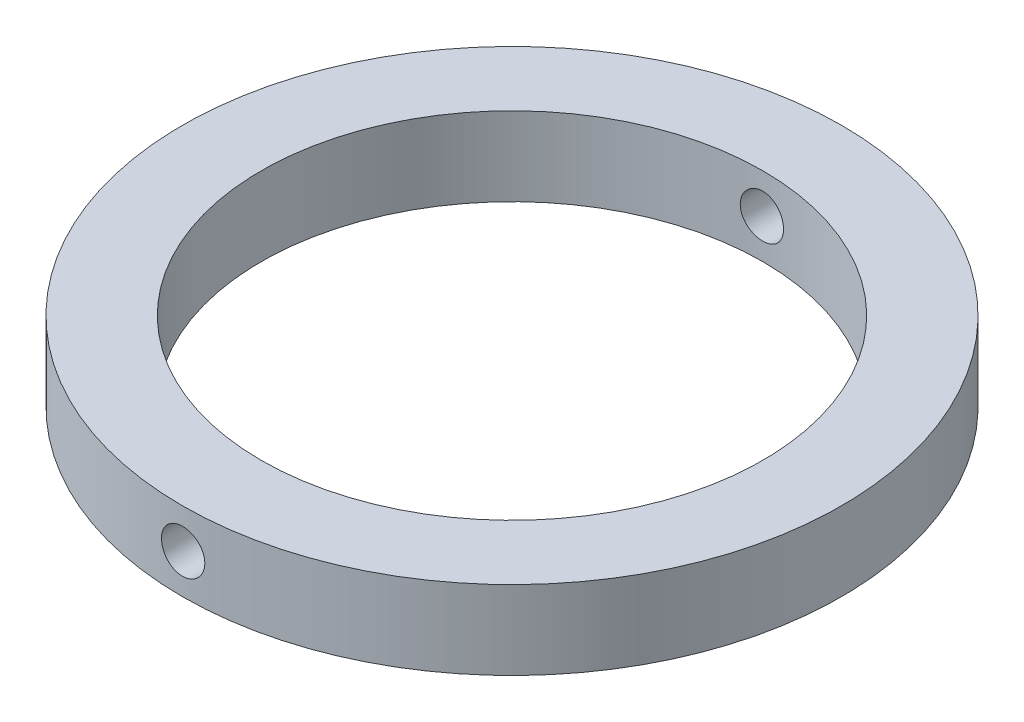
ISO-10303-21;
HEADER;
FILE_DESCRIPTION(('STEP AP214'),'2;1');
FILE_NAME('part.step','',(''),(''),'','','');
FILE_SCHEMA(('AUTOMOTIVE_DESIGN { 1 0 10303 214 1 1 1 1 }'));
ENDSEC;
DATA;
#1=APPLICATION_CONTEXT('core data for automotive mechanical design processes');
#2=APPLICATION_PROTOCOL_DEFINITION('international standard','automotive_design',2000,#1);
#3=PRODUCT_CONTEXT('',#1,'mechanical');
#4=PRODUCT('Part','Part','',(#3));
#5=PRODUCT_RELATED_PRODUCT_CATEGORY('part','',(#4));
#6=PRODUCT_DEFINITION_FORMATION('','',#4);
#7=PRODUCT_DEFINITION_CONTEXT('part definition',#1,'design');
#8=PRODUCT_DEFINITION('design','',#6,#7);
#9=PRODUCT_DEFINITION_SHAPE('','',#8);
#10=(LENGTH_UNIT() NAMED_UNIT(*) SI_UNIT(.MILLI.,.METRE.));
#11=(NAMED_UNIT(*) PLANE_ANGLE_UNIT() SI_UNIT($,.RADIAN.));
#12=(NAMED_UNIT(*) SI_UNIT($,.STERADIAN.) SOLID_ANGLE_UNIT());
#13=UNCERTAINTY_MEASURE_WITH_UNIT(LENGTH_MEASURE(1.E-05),#10,'distance_accuracy_value','');
#14=(GEOMETRIC_REPRESENTATION_CONTEXT(3) GLOBAL_UNCERTAINTY_ASSIGNED_CONTEXT((#13)) GLOBAL_UNIT_ASSIGNED_CONTEXT((#10,
#11,#12)) REPRESENTATION_CONTEXT('',''));
#15=CARTESIAN_POINT('',(0.,0.,0.));
#16=DIRECTION('',(0.,0.,1.));
#17=DIRECTION('',(1.,0.,0.));
#18=AXIS2_PLACEMENT_3D('',#15,#16,#17);
#19=CARTESIAN_POINT('',(0.,10.,0.));
#20=DIRECTION('',(0.,-1.,0.));
#21=DIRECTION('',(0.,0.,-1.));
#22=AXIS2_PLACEMENT_3D('',#19,#20,#21);
#23=CYLINDRICAL_SURFACE('',#22,41.85);
#24=CARTESIAN_POINT('',(0.,10.,0.));
#25=DIRECTION('',(0.,1.,0.));
#26=DIRECTION('',(0.,0.,1.));
#27=AXIS2_PLACEMENT_3D('',#24,#25,#26);
#28=CIRCLE('',#27,41.85);
#29=CARTESIAN_POINT('',(0.,10.,41.85));
#30=VERTEX_POINT('',#29);
#31=EDGE_CURVE('E10',#30,#30,#28,.T.);
#32=ORIENTED_EDGE('',*,*,#31,.F.);
#33=EDGE_LOOP('',(#32));
#34=FACE_BOUND('',#33,.T.);
#35=CARTESIAN_POINT('',(0.,0.,0.));
#36=DIRECTION('',(0.,1.,0.));
#37=DIRECTION('',(0.,0.,1.));
#38=AXIS2_PLACEMENT_3D('',#35,#36,#37);
#39=CIRCLE('',#38,41.85);
#40=CARTESIAN_POINT('',(0.,0.,41.85));
#41=VERTEX_POINT('',#40);
#42=EDGE_CURVE('E48',#41,#41,#39,.T.);
#43=ORIENTED_EDGE('',*,*,#42,.T.);
#44=EDGE_LOOP('',(#43));
#45=FACE_BOUND('',#44,.T.);
#46=CARTESIAN_POINT('',(0.,7.75,-41.85));
#47=CARTESIAN_POINT('',(0.154290099332612,7.74999321754741,-41.8499988011758));
#48=CARTESIAN_POINT('',(0.308687825769506,7.73697157858766,-41.8491376375957));
#49=CARTESIAN_POINT('',(0.613218841201266,7.68521323826535,-41.8457850773138));
#50=CARTESIAN_POINT('',(0.763346973857226,7.64644671476278,-41.8432917900545));
#51=CARTESIAN_POINT('',(1.05488365405529,7.54431791111544,-41.8369569989291));
#52=CARTESIAN_POINT('',(1.19629680024165,7.48096873354768,-41.8331162133853));
#53=CARTESIAN_POINT('',(1.46644583797839,7.33149442391011,-41.8245182357857));
#54=CARTESIAN_POINT('',(1.59518459769578,7.24537446111875,-41.8197612517859));
#55=CARTESIAN_POINT('',(1.83657817459748,7.05264884275964,-41.8098567335951));
#56=CARTESIAN_POINT('',(1.94920943303032,6.94601370536758,-41.804708643878));
#57=CARTESIAN_POINT('',(2.15498922700986,6.71534579064044,-41.7946068640215));
#58=CARTESIAN_POINT('',(2.24813694296539,6.59131228179512,-41.7896531820671));
#59=CARTESIAN_POINT('',(2.41237951241051,6.32923328148415,-41.7804945168638));
#60=CARTESIAN_POINT('',(2.48345457634963,6.19117536253465,-41.7762902069053));
#61=CARTESIAN_POINT('',(2.60140770033902,5.90505354364975,-41.7691116752754));
#62=CARTESIAN_POINT('',(2.64828604313305,5.75698976065784,-41.7661374392305));
#63=CARTESIAN_POINT('',(2.71644905753053,5.45528799244626,-41.7617598003493));
#64=CARTESIAN_POINT('',(2.73777093124992,5.30165844590535,-41.7603541144079));
#65=CARTESIAN_POINT('',(2.75433061301864,4.99299495634095,-41.7592652613331));
#66=CARTESIAN_POINT('',(2.74956874274023,4.8379610306602,-41.7595820729574));
#67=CARTESIAN_POINT('',(2.71412695981282,4.53114331553306,-41.7619003689473));
#68=CARTESIAN_POINT('',(2.683487327807,4.37935485056886,-41.7638992350534));
#69=CARTESIAN_POINT('',(2.59722226061068,4.08308011249805,-41.769352265633));
#70=CARTESIAN_POINT('',(2.54159666285057,3.9385938869098,-41.7728064395754));
#71=CARTESIAN_POINT('',(2.40689302759663,3.6608957926856,-41.7807838468435));
#72=CARTESIAN_POINT('',(2.32779674482857,3.5276927991685,-41.7853079113064));
#73=CARTESIAN_POINT('',(2.1484102038833,3.27643934494015,-41.7949144584274));
#74=CARTESIAN_POINT('',(2.04811968150902,3.15838907314484,-41.7999969480461));
#75=CARTESIAN_POINT('',(1.82896480218378,2.94055773694956,-41.8101592283428));
#76=CARTESIAN_POINT('',(1.71006558988451,2.8408117352164,-41.8152389956332));
#77=CARTESIAN_POINT('',(1.4571905540584,2.66269090365282,-41.8248141399912));
#78=CARTESIAN_POINT('',(1.32321472472832,2.58431608204856,-41.829309516834));
#79=CARTESIAN_POINT('',(1.04396806424317,2.45116524605297,-41.8372097464952));
#80=CARTESIAN_POINT('',(0.898696583449396,2.39639059014784,-41.8406145365338));
#81=CARTESIAN_POINT('',(0.600991973656429,2.31201851186089,-41.8459491056359));
#82=CARTESIAN_POINT('',(0.44855893711889,2.2824207645184,-41.8478789037373));
#83=CARTESIAN_POINT('',(0.141162405527342,2.24928619099311,-41.8500435844614));
#84=CARTESIAN_POINT('',(-0.0137958435674341,2.24570089380397,-41.8502816194599));
#85=CARTESIAN_POINT('',(-0.322111494498557,2.26456630211203,-41.8490443411495));
#86=CARTESIAN_POINT('',(-0.475468905551681,2.28701685762509,-41.8475690377105));
#87=CARTESIAN_POINT('',(-0.776092853861847,2.35727654288242,-41.8430731701016));
#88=CARTESIAN_POINT('',(-0.923364617797856,2.40506340308875,-41.8400539630403));
#89=CARTESIAN_POINT('',(-1.20779816693384,2.52461656904448,-41.8328098889319));
#90=CARTESIAN_POINT('',(-1.34495985170388,2.59638311296036,-41.8285850099103));
#91=CARTESIAN_POINT('',(-1.60550150430209,2.76198163226646,-41.8193963040407));
#92=CARTESIAN_POINT('',(-1.72886088017293,2.85584594490211,-41.8144313982026));
#93=CARTESIAN_POINT('',(-1.95808882318597,3.06292851796911,-41.8043248823149));
#94=CARTESIAN_POINT('',(-2.06395720041093,3.17614698852076,-41.7991832703473));
#95=CARTESIAN_POINT('',(-2.255362406773,3.41893330820694,-41.7892936761702));
#96=CARTESIAN_POINT('',(-2.34086776488973,3.54852599666441,-41.7845463105478));
#97=CARTESIAN_POINT('',(-2.4889044098989,3.82025741406678,-41.7759904323852));
#98=CARTESIAN_POINT('',(-2.5514358505387,3.96239605904303,-41.772181913562));
#99=CARTESIAN_POINT('',(-2.65169524528746,4.25507012213475,-41.7659376892427));
#100=CARTESIAN_POINT('',(-2.68944293341243,4.40559875586404,-41.7635008917372));
#101=CARTESIAN_POINT('',(-2.73912772853688,4.71087389977274,-41.7602718954646));
#102=CARTESIAN_POINT('',(-2.75106512394346,4.86562036280208,-41.7594796783207));
#103=CARTESIAN_POINT('',(-2.74878763293919,5.17462559078792,-41.7596296300074));
#104=CARTESIAN_POINT('',(-2.73462221841803,5.32888472439922,-41.7605685179271));
#105=CARTESIAN_POINT('',(-2.6806438619129,5.63282899559131,-41.7640679273305));
#106=CARTESIAN_POINT('',(-2.64083087428527,5.78251412503148,-41.7666284516999));
#107=CARTESIAN_POINT('',(-2.53669886815668,6.07306820030999,-41.7730817810187));
#108=CARTESIAN_POINT('',(-2.472380157137,6.21393725674066,-41.7769745692516));
#109=CARTESIAN_POINT('',(-2.32106902496006,6.48288400887214,-41.7856537102544));
#110=CARTESIAN_POINT('',(-2.23407715953305,6.61096201798146,-41.7904400411222));
#111=CARTESIAN_POINT('',(-2.03970545239938,6.85094240947175,-41.8003775294771));
#112=CARTESIAN_POINT('',(-1.93228965654435,6.96281564381602,-41.8055293201369));
#113=CARTESIAN_POINT('',(-1.70017112323984,7.16698201260253,-41.8156117188951));
#114=CARTESIAN_POINT('',(-1.57546416925335,7.25927035723655,-41.8205422726544));
#115=CARTESIAN_POINT('',(-1.31214821799897,7.42172256832539,-41.8296322322455));
#116=CARTESIAN_POINT('',(-1.17352108598708,7.49185706746362,-41.8337906114939));
#117=CARTESIAN_POINT('',(-0.886531552137562,7.60776872481375,-41.8408541940417));
#118=CARTESIAN_POINT('',(-0.73818075243376,7.65357433825889,-41.8437608605963));
#119=CARTESIAN_POINT('',(-0.490772188367824,7.70765506650704,-41.8472338972108));
#120=CARTESIAN_POINT('',(-0.393312628345785,7.7235138062974,-41.8482665606961));
#121=CARTESIAN_POINT('',(-0.197250043047792,7.74468843311883,-41.8496499948046));
#122=CARTESIAN_POINT('',(-0.098647019538159,7.75000433643335,-41.850000766481));
#123=CARTESIAN_POINT('',(0.,7.75,-41.85));
#124=B_SPLINE_CURVE_WITH_KNOTS('',3,(#46,#47,#48,#49,#50,#51,#52,#53,#54,#55,#56,#57,#58,#59,
#60,#61,#62,#63,#64,#65,#66,#67,#68,#69,#70,#71,#72,#73,#74,#75,#76,#77,#78,#79,#80,#81,#82,#83,
#84,#85,#86,#87,#88,#89,#90,#91,#92,#93,#94,#95,#96,#97,#98,#99,#100,#101,#102,#103,#104,#105,
#106,#107,#108,#109,#110,#111,#112,#113,#114,#115,#116,#117,#118,#119,#120,#121,#122,#123),
.UNSPECIFIED.,.T.,.F.,(4,2,2,2,2,2,2,2,2,2,2,2,2,2,2,2,2,2,2,2,2,2,2,2,2,2,2,2,2,2,2,2,2,2,2,2,
2,2,4),(0.,0.462510171268374,0.925557037819973,1.38835743821623,1.8510528666862,
2.31441825776961,2.77780313677942,3.24160227862634,3.70539600076009,4.1685137631446,
4.63162581423995,5.09401832303994,5.55641384041119,6.01916975346513,6.4819314353491,
6.94557051042958,7.40920976397302,7.87287570221902,8.33653565579533,8.79933141356662,
9.26212450533419,9.72451149430553,10.1869030758461,10.6499755608511,11.1130530735666,
11.5768416937236,12.0406272100314,12.5040429886966,12.9674535890752,13.4299868041329,
13.8925208423395,14.3550490771723,14.8175659762748,15.2809047543452,15.7443567193051,
16.2084204864863,16.6719402795252,16.9676515440041,17.2633623517557),.UNSPECIFIED.);
#125=CARTESIAN_POINT('',(0.,7.75,-41.85));
#126=VERTEX_POINT('',#125);
#127=EDGE_CURVE('E81',#126,#126,#124,.T.);
#128=ORIENTED_EDGE('',*,*,#127,.F.);
#129=EDGE_LOOP('',(#128));
#130=FACE_BOUND('',#129,.T.);
#131=CARTESIAN_POINT('',(0.,2.25,41.85));
#132=CARTESIAN_POINT('',(0.154290099332612,2.25000678245259,41.8499988011758));
#133=CARTESIAN_POINT('',(0.308687825769506,2.26302842141234,41.8491376375957));
#134=CARTESIAN_POINT('',(0.613218841201266,2.31478676173465,41.8457850773138));
#135=CARTESIAN_POINT('',(0.763346973857226,2.35355328523722,41.8432917900545));
#136=CARTESIAN_POINT('',(1.05488365405529,2.45568208888456,41.8369569989291));
#137=CARTESIAN_POINT('',(1.19629680024165,2.51903126645232,41.8331162133853));
#138=CARTESIAN_POINT('',(1.46644583797838,2.66850557608989,41.8245182357857));
#139=CARTESIAN_POINT('',(1.59518459769578,2.75462553888125,41.8197612517859));
#140=CARTESIAN_POINT('',(1.83657817459748,2.94735115724036,41.8098567335951));
#141=CARTESIAN_POINT('',(1.94920943303032,3.05398629463242,41.804708643878));
#142=CARTESIAN_POINT('',(2.15498922700985,3.28465420935956,41.7946068640215));
#143=CARTESIAN_POINT('',(2.24813694296538,3.40868771820488,41.7896531820671));
#144=CARTESIAN_POINT('',(2.41237951241051,3.67076671851585,41.7804945168638));
#145=CARTESIAN_POINT('',(2.48345457634963,3.80882463746535,41.7762902069053));
#146=CARTESIAN_POINT('',(2.60140770033902,4.09494645635025,41.7691116752755));
#147=CARTESIAN_POINT('',(2.64828604313305,4.24301023934216,41.7661374392305));
#148=CARTESIAN_POINT('',(2.71644905753053,4.54471200755374,41.7617598003493));
#149=CARTESIAN_POINT('',(2.73777093124992,4.69834155409465,41.7603541144079));
#150=CARTESIAN_POINT('',(2.75433061301864,5.00700504365905,41.7592652613331));
#151=CARTESIAN_POINT('',(2.74956874274023,5.1620389693398,41.7595820729574));
#152=CARTESIAN_POINT('',(2.71412695981282,5.46885668446694,41.7619003689473));
#153=CARTESIAN_POINT('',(2.683487327807,5.62064514943114,41.7638992350534));
#154=CARTESIAN_POINT('',(2.59722226061068,5.91691988750195,41.769352265633));
#155=CARTESIAN_POINT('',(2.54159666285057,6.0614061130902,41.7728064395754));
#156=CARTESIAN_POINT('',(2.40689302759663,6.3391042073144,41.7807838468435));
#157=CARTESIAN_POINT('',(2.32779674482857,6.4723072008315,41.7853079113064));
#158=CARTESIAN_POINT('',(2.1484102038833,6.72356065505985,41.7949144584274));
#159=CARTESIAN_POINT('',(2.04811968150902,6.84161092685516,41.7999969480461));
#160=CARTESIAN_POINT('',(1.82896480218378,7.05944226305044,41.8101592283428));
#161=CARTESIAN_POINT('',(1.71006558988451,7.1591882647836,41.8152389956332));
#162=CARTESIAN_POINT('',(1.4571905540584,7.33730909634719,41.8248141399912));
#163=CARTESIAN_POINT('',(1.32321472472832,7.41568391795145,41.829309516834));
#164=CARTESIAN_POINT('',(1.04396806424316,7.54883475394703,41.8372097464952));
#165=CARTESIAN_POINT('',(0.898696583449393,7.60360940985217,41.8406145365338));
#166=CARTESIAN_POINT('',(0.600991973656427,7.68798148813911,41.8459491056359));
#167=CARTESIAN_POINT('',(0.448558937118888,7.7175792354816,41.8478789037373));
#168=CARTESIAN_POINT('',(0.141162405527341,7.75071380900689,41.8500435844614));
#169=CARTESIAN_POINT('',(-0.013795843567435,7.75429910619603,41.8502816194599));
#170=CARTESIAN_POINT('',(-0.322111494498558,7.73543369788796,41.8490443411495));
#171=CARTESIAN_POINT('',(-0.475468905551682,7.71298314237491,41.8475690377105));
#172=CARTESIAN_POINT('',(-0.776092853861848,7.64272345711758,41.8430731701016));
#173=CARTESIAN_POINT('',(-0.923364617797856,7.59493659691124,41.8400539630403));
#174=CARTESIAN_POINT('',(-1.20779816693384,7.47538343095552,41.8328098889319));
#175=CARTESIAN_POINT('',(-1.34495985170389,7.40361688703964,41.8285850099103));
#176=CARTESIAN_POINT('',(-1.60550150430209,7.23801836773354,41.8193963040407));
#177=CARTESIAN_POINT('',(-1.72886088017293,7.14415405509789,41.8144313982026));
#178=CARTESIAN_POINT('',(-1.95808882318597,6.93707148203089,41.8043248823149));
#179=CARTESIAN_POINT('',(-2.06395720041093,6.82385301147924,41.7991832703473));
#180=CARTESIAN_POINT('',(-2.255362406773,6.58106669179306,41.7892936761702));
#181=CARTESIAN_POINT('',(-2.34086776488973,6.45147400333559,41.7845463105478));
#182=CARTESIAN_POINT('',(-2.4889044098989,6.17974258593322,41.7759904323852));
#183=CARTESIAN_POINT('',(-2.5514358505387,6.03760394095697,41.772181913562));
#184=CARTESIAN_POINT('',(-2.65169524528746,5.74492987786525,41.7659376892427));
#185=CARTESIAN_POINT('',(-2.68944293341243,5.59440124413596,41.7635008917372));
#186=CARTESIAN_POINT('',(-2.73912772853688,5.28912610022726,41.7602718954646));
#187=CARTESIAN_POINT('',(-2.75106512394346,5.13437963719792,41.7594796783207));
#188=CARTESIAN_POINT('',(-2.74878763293919,4.82537440921208,41.7596296300074));
#189=CARTESIAN_POINT('',(-2.73462221841803,4.67111527560078,41.7605685179271));
#190=CARTESIAN_POINT('',(-2.6806438619129,4.36717100440869,41.7640679273305));
#191=CARTESIAN_POINT('',(-2.64083087428527,4.21748587496852,41.7666284516999));
#192=CARTESIAN_POINT('',(-2.53669886815668,3.92693179969001,41.7730817810187));
#193=CARTESIAN_POINT('',(-2.472380157137,3.78606274325934,41.7769745692516));
#194=CARTESIAN_POINT('',(-2.32106902496006,3.51711599112786,41.7856537102544));
#195=CARTESIAN_POINT('',(-2.23407715953305,3.38903798201854,41.7904400411222));
#196=CARTESIAN_POINT('',(-2.03970545239938,3.14905759052825,41.8003775294771));
#197=CARTESIAN_POINT('',(-1.93228965654435,3.03718435618398,41.8055293201369));
#198=CARTESIAN_POINT('',(-1.70017112323984,2.83301798739747,41.8156117188951));
#199=CARTESIAN_POINT('',(-1.57546416925335,2.74072964276345,41.8205422726544));
#200=CARTESIAN_POINT('',(-1.31214821799897,2.57827743167461,41.8296322322455));
#201=CARTESIAN_POINT('',(-1.17352108598708,2.50814293253638,41.8337906114939));
#202=CARTESIAN_POINT('',(-0.886531552137561,2.39223127518625,41.8408541940417));
#203=CARTESIAN_POINT('',(-0.738180752433758,2.34642566174111,41.8437608605963));
#204=CARTESIAN_POINT('',(-0.490772188367822,2.29234493349296,41.8472338972108));
#205=CARTESIAN_POINT('',(-0.393312628345784,2.2764861937026,41.8482665606961));
#206=CARTESIAN_POINT('',(-0.197250043047792,2.25531156688117,41.8496499948046));
#207=CARTESIAN_POINT('',(-0.0986470195381588,2.24999566356665,41.850000766481));
#208=CARTESIAN_POINT('',(0.,2.25,41.85));
#209=B_SPLINE_CURVE_WITH_KNOTS('',3,(#131,#132,#133,#134,#135,#136,#137,#138,#139,#140,#141,
#142,#143,#144,#145,#146,#147,#148,#149,#150,#151,#152,#153,#154,#155,#156,#157,#158,#159,#160,
#161,#162,#163,#164,#165,#166,#167,#168,#169,#170,#171,#172,#173,#174,#175,#176,#177,#178,#179,
#180,#181,#182,#183,#184,#185,#186,#187,#188,#189,#190,#191,#192,#193,#194,#195,#196,#197,#198,
#199,#200,#201,#202,#203,#204,#205,#206,#207,#208),.UNSPECIFIED.,.T.,.F.,(4,2,2,2,2,2,2,2,2,2,2,
2,2,2,2,2,2,2,2,2,2,2,2,2,2,2,2,2,2,2,2,2,2,2,2,2,2,2,4),(0.,0.462510171268374,
0.925557037819972,1.38835743821623,1.8510528666862,2.31441825776961,2.77780313677942,
3.24160227862634,3.70539600076009,4.1685137631446,4.63162581423995,5.09401832303994,
5.5564138404112,6.01916975346513,6.4819314353491,6.94557051042958,7.40920976397302,
7.87287570221902,8.33653565579533,8.79933141356662,9.26212450533419,9.72451149430552,
10.1869030758461,10.6499755608511,11.1130530735666,11.5768416937236,12.0406272100314,
12.5040429886966,12.9674535890752,13.4299868041329,13.8925208423395,14.3550490771723,
14.8175659762748,15.2809047543452,15.7443567193051,16.2084204864863,16.6719402795252,
16.9676515440041,17.2633623517557),.UNSPECIFIED.);
#210=CARTESIAN_POINT('',(0.,2.25,41.85));
#211=VERTEX_POINT('',#210);
#212=EDGE_CURVE('E76',#211,#211,#209,.T.);
#213=ORIENTED_EDGE('',*,*,#212,.F.);
#214=EDGE_LOOP('',(#213));
#215=FACE_BOUND('',#214,.T.);
#216=ADVANCED_FACE('F35',(#34,#45,#130,#215),#23,.T.);
#217=CARTESIAN_POINT('',(0.,10.,0.));
#218=DIRECTION('',(0.,-1.,0.));
#219=DIRECTION('',(0.,0.,-1.));
#220=AXIS2_PLACEMENT_3D('',#217,#218,#219);
#221=CYLINDRICAL_SURFACE('',#220,31.85);
#222=CARTESIAN_POINT('',(-2.75,5.,31.7310573413494));
#223=CARTESIAN_POINT('',(-2.74999327464815,4.84584049601565,31.7310589144226));
#224=CARTESIAN_POINT('',(-2.73699357154665,4.69157654672714,31.7321928714091));
#225=CARTESIAN_POINT('',(-2.68532747628351,4.38731838826,31.736606035033));
#226=CARTESIAN_POINT('',(-2.64663213474048,4.2373291941343,31.7398876612308));
#227=CARTESIAN_POINT('',(-2.54470351124203,3.94607117205223,31.7482217312205));
#228=CARTESIAN_POINT('',(-2.48148430164817,3.80479739677463,31.7532731592988));
#229=CARTESIAN_POINT('',(-2.33232788089161,3.534899562146,31.7645763972289));
#230=CARTESIAN_POINT('',(-2.2463954687969,3.40627283846952,31.7708279534296));
#231=CARTESIAN_POINT('',(-2.05399729774003,3.16493405204895,31.7838463197892));
#232=CARTESIAN_POINT('',(-1.9474820254999,3.05226152397204,31.7906143481053));
#233=CARTESIAN_POINT('',(-1.71704668770947,2.84636927658259,31.8038919345023));
#234=CARTESIAN_POINT('',(-1.59312585623239,2.75315041377213,31.8104014811926));
#235=CARTESIAN_POINT('',(-1.33115995944677,2.5886790737895,31.8224402943237));
#236=CARTESIAN_POINT('',(-1.19309324009227,2.51746096437285,31.8279680213798));
#237=CARTESIAN_POINT('',(-0.9069056968956,2.39923258561946,31.8374072187792));
#238=CARTESIAN_POINT('',(-0.758785060612915,2.35222186482549,31.8413187192641));
#239=CARTESIAN_POINT('',(-0.457089061022622,2.28385696946513,31.8470762230164));
#240=CARTESIAN_POINT('',(-0.303528338819536,2.26243862520849,31.8489273915061));
#241=CARTESIAN_POINT('',(0.00501882182117302,2.24566807026574,31.8503731703412));
#242=CARTESIAN_POINT('',(0.160005231935409,2.25031534285956,31.8499678254192));
#243=CARTESIAN_POINT('',(0.46656908152606,2.28549168886173,31.8469505046951));
#244=CARTESIAN_POINT('',(0.61815450477759,2.3159517581092,31.8443444121152));
#245=CARTESIAN_POINT('',(0.914053175254278,2.40178171839297,31.8372254462699));
#246=CARTESIAN_POINT('',(1.0583663489739,2.45715186115609,31.8327125537355));
#247=CARTESIAN_POINT('',(1.33584323138206,2.59130691132313,31.8222775144266));
#248=CARTESIAN_POINT('',(1.46899195583066,2.67012266100756,31.8163535134221));
#249=CARTESIAN_POINT('',(1.72019679784698,2.84890924119656,31.8037618205292));
#250=CARTESIAN_POINT('',(1.83825258633506,2.94888053284099,31.7970941124312));
#251=CARTESIAN_POINT('',(2.05632396529513,3.16752915248568,31.7837384850792));
#252=CARTESIAN_POINT('',(2.15627943551881,3.28626645206916,31.777050570866));
#253=CARTESIAN_POINT('',(2.33484817054802,3.53886775139314,31.7644301551017));
#254=CARTESIAN_POINT('',(2.41346141582365,3.67273176497569,31.7584976542419));
#255=CARTESIAN_POINT('',(2.54711220453252,3.95182946349719,31.7480587739206));
#256=CARTESIAN_POINT('',(2.60214652871223,4.09706469776066,31.7435525892176));
#257=CARTESIAN_POINT('',(2.68703223020086,4.39476155352247,31.7364803982771));
#258=CARTESIAN_POINT('',(2.71688417644374,4.54722301167984,31.7339143482073));
#259=CARTESIAN_POINT('',(2.75048142162092,4.85451812796044,31.7310201698648));
#260=CARTESIAN_POINT('',(2.75431060405077,5.00934255003956,31.7306848509798));
#261=CARTESIAN_POINT('',(2.73597345143062,5.3174310568115,31.7322711236076));
#262=CARTESIAN_POINT('',(2.71380737695708,5.47069515712945,31.7341926924974));
#263=CARTESIAN_POINT('',(2.64417889687599,5.77107098179408,31.7400696752922));
#264=CARTESIAN_POINT('',(2.59675572405191,5.91819186744002,31.7440219345159));
#265=CARTESIAN_POINT('',(2.47799912923418,6.20238899144874,31.7535123735878));
#266=CARTESIAN_POINT('',(2.40666529591761,6.33946505696616,31.7590505807179));
#267=CARTESIAN_POINT('',(2.24190038136812,6.60006505821274,31.7711063296561));
#268=CARTESIAN_POINT('',(2.1484134541417,6.72355356968299,31.7776263310862));
#269=CARTESIAN_POINT('',(1.94207665527807,6.95311484952063,31.7909027590321));
#270=CARTESIAN_POINT('',(1.8292264261439,7.05918729627136,31.7976591899113));
#271=CARTESIAN_POINT('',(1.58700370234072,7.25119225482805,31.810668658439));
#272=CARTESIAN_POINT('',(1.45758789106498,7.33707022817078,31.8169203036362));
#273=CARTESIAN_POINT('',(1.18612315787096,7.48587408933383,31.8281957061433));
#274=CARTESIAN_POINT('',(1.04407437016561,7.54880022095864,31.8332194764959));
#275=CARTESIAN_POINT('',(0.751570508204358,7.64982070348671,31.8414666990844));
#276=CARTESIAN_POINT('',(0.601127107571805,7.68794864847193,31.8446925860594));
#277=CARTESIAN_POINT('',(0.295944795518786,7.73840021616356,31.8489904759385));
#278=CARTESIAN_POINT('',(0.141205972046326,7.75072436680371,31.8500625229091));
#279=CARTESIAN_POINT('',(-0.167637446277073,7.74921214424712,31.8499319952806));
#280=CARTESIAN_POINT('',(-0.321742467255064,7.7354607107719,31.8487368060684));
#281=CARTESIAN_POINT('',(-0.625445443258189,7.68236496584218,31.8442206936679));
#282=CARTESIAN_POINT('',(-0.775043392540225,7.64302062177757,31.8408997677709));
#283=CARTESIAN_POINT('',(-1.06549013508529,7.53987782732285,31.8325046985461));
#284=CARTESIAN_POINT('',(-1.20633953398274,7.47608107189313,31.8274306767395));
#285=CARTESIAN_POINT('',(-1.47534270404746,7.32585399370545,31.8160967269572));
#286=CARTESIAN_POINT('',(-1.6034966546161,7.23942399084437,31.8098368157432));
#287=CARTESIAN_POINT('',(-1.84390600471211,7.04606491238456,31.7968091830154));
#288=CARTESIAN_POINT('',(-1.95611068712053,6.93907288104674,31.7900399418284));
#289=CARTESIAN_POINT('',(-2.16101625771548,6.70774295195354,31.776769524567));
#290=CARTESIAN_POINT('',(-2.25371242350905,6.58340086638658,31.7702684137041));
#291=CARTESIAN_POINT('',(-2.41710502678074,6.32064191524708,31.7582563957142));
#292=CARTESIAN_POINT('',(-2.48775746720019,6.18219762403014,31.7527474780476));
#293=CARTESIAN_POINT('',(-2.60472246990605,5.89545686619147,31.7433677433779));
#294=CARTESIAN_POINT('',(-2.65106292731057,5.74717191169485,31.7394950499996));
#295=CARTESIAN_POINT('',(-2.70632720341545,5.49834821555678,31.7348190087192));
#296=CARTESIAN_POINT('',(-2.7226826302574,5.39940827165375,31.7334148990026));
#297=CARTESIAN_POINT('',(-2.74452119799387,5.20032692020612,31.7315335555169));
#298=CARTESIAN_POINT('',(-2.7500043706864,5.10018551617629,31.731056319037));
#299=CARTESIAN_POINT('',(-2.75,5.,31.7310573413494));
#300=B_SPLINE_CURVE_WITH_KNOTS('',3,(#222,#223,#224,#225,#226,#227,#228,#229,#230,#231,#232,
#233,#234,#235,#236,#237,#238,#239,#240,#241,#242,#243,#244,#245,#246,#247,#248,#249,#250,#251,
#252,#253,#254,#255,#256,#257,#258,#259,#260,#261,#262,#263,#264,#265,#266,#267,#268,#269,#270,
#271,#272,#273,#274,#275,#276,#277,#278,#279,#280,#281,#282,#283,#284,#285,#286,#287,#288,#289,
#290,#291,#292,#293,#294,#295,#296,#297,#298,#299),.UNSPECIFIED.,.T.,.F.,(4,2,2,2,2,2,2,2,2,2,2,
2,2,2,2,2,2,2,2,2,2,2,2,2,2,2,2,2,2,2,2,2,2,2,2,2,2,2,4),(0.,0.462112705360054,
0.924746924340231,1.38711606488685,1.84938758953781,2.31278529900263,2.77620340654652,
3.24034180901255,3.70447155518614,4.16743509539441,4.63038945792978,5.09211011578676,
5.55383543963074,6.0161708613664,6.47851636193874,6.94237044972626,7.40622496197712,
7.87014278457981,8.33405012581831,8.79646136522111,9.25886796945324,9.72055838640998,
10.1822567459997,10.6451316261677,11.1080150531308,11.5721345723688,12.0362491613828,
12.4997336978986,12.9632087516416,13.4251766550231,13.8871451470381,14.3490816227126,
14.8110115697586,15.2743790349292,15.7378585379751,16.2022572677746,16.6661219832883,
16.9664416789713,17.2667604963101),.UNSPECIFIED.);
#301=CARTESIAN_POINT('',(-2.75,5.,31.7310573413494));
#302=VERTEX_POINT('',#301);
#303=EDGE_CURVE('E58',#302,#302,#300,.T.);
#304=ORIENTED_EDGE('',*,*,#303,.T.);
#305=EDGE_LOOP('',(#304));
#306=FACE_BOUND('',#305,.T.);
#307=CARTESIAN_POINT('',(0.,10.,0.));
#308=DIRECTION('',(0.,1.,0.));
#309=DIRECTION('',(0.,0.,1.));
#310=AXIS2_PLACEMENT_3D('',#307,#308,#309);
#311=CIRCLE('',#310,31.85);
#312=CARTESIAN_POINT('',(0.,10.,31.85));
#313=VERTEX_POINT('',#312);
#314=EDGE_CURVE('E53',#313,#313,#311,.T.);
#315=ORIENTED_EDGE('',*,*,#314,.T.);
#316=EDGE_LOOP('',(#315));
#317=FACE_BOUND('',#316,.T.);
#318=CARTESIAN_POINT('',(0.,0.,0.));
#319=DIRECTION('',(0.,1.,0.));
#320=DIRECTION('',(0.,0.,1.));
#321=AXIS2_PLACEMENT_3D('',#318,#319,#320);
#322=CIRCLE('',#321,31.85);
#323=CARTESIAN_POINT('',(0.,0.,31.85));
#324=VERTEX_POINT('',#323);
#325=EDGE_CURVE('E56',#324,#324,#322,.T.);
#326=ORIENTED_EDGE('',*,*,#325,.F.);
#327=EDGE_LOOP('',(#326));
#328=FACE_BOUND('',#327,.T.);
#329=CARTESIAN_POINT('',(0.,7.75,-31.85));
#330=CARTESIAN_POINT('',(0.154160711688694,7.74999327573487,-31.84999844859));
#331=CARTESIAN_POINT('',(0.308425864777486,7.73699337583557,-31.8488688191871));
#332=CARTESIAN_POINT('',(0.612686524472508,7.68532642779682,-31.8444711161383));
#333=CARTESIAN_POINT('',(0.762677016970373,7.64663043442406,-31.8412006309955));
#334=CARTESIAN_POINT('',(1.05393778419342,7.54469990403076,-31.8328907301448));
#335=CARTESIAN_POINT('',(1.19521299524477,7.48147940834501,-31.8278523268035));
#336=CARTESIAN_POINT('',(1.46511323449966,7.33231995914836,-31.8165713436228));
#337=CARTESIAN_POINT('',(1.59374092882777,7.246385807874,-31.8103290183979));
#338=CARTESIAN_POINT('',(1.83507861470681,7.0539858818632,-31.7973214392859));
#339=CARTESIAN_POINT('',(1.94774938010586,6.94747098222139,-31.7905549578983));
#340=CARTESIAN_POINT('',(2.15363822678924,6.71703712912234,-31.7772719652155));
#341=CARTESIAN_POINT('',(2.24685544616681,6.59311740493555,-31.7707554650062));
#342=CARTESIAN_POINT('',(2.41132507112396,6.3311524738654,-31.7586971878124));
#343=CARTESIAN_POINT('',(2.48254280613814,6.19308542255693,-31.7531569552402));
#344=CARTESIAN_POINT('',(2.60077040106156,5.90689715773979,-31.7436927844594));
#345=CARTESIAN_POINT('',(2.64778071689471,5.75877613364769,-31.7397688158103));
#346=CARTESIAN_POINT('',(2.7161447608434,5.45707896494112,-31.7339919315559));
#347=CARTESIAN_POINT('',(2.73756262500762,5.30351745419212,-31.7321338395704));
#348=CARTESIAN_POINT('',(2.754331946575,4.99496875094251,-31.730682786062));
#349=CARTESIAN_POINT('',(2.74968392585372,4.83998158704749,-31.7310897791891));
#350=CARTESIAN_POINT('',(2.71450639934633,4.5334210474295,-31.7341182023035));
#351=CARTESIAN_POINT('',(2.68404665069307,4.38183959993317,-31.7367336637574));
#352=CARTESIAN_POINT('',(2.59821871124652,4.08594871558314,-31.7438749713274));
#353=CARTESIAN_POINT('',(2.54285026151253,3.94163935434443,-31.7484008373034));
#354=CARTESIAN_POINT('',(2.40869870872137,3.66416707809035,-31.758859871553));
#355=CARTESIAN_POINT('',(2.32988436701836,3.53101933981163,-31.7647949152322));
#356=CARTESIAN_POINT('',(2.15110078752461,3.27981587222059,-31.7774018682047));
#357=CARTESIAN_POINT('',(2.05113108936129,3.16176047143009,-31.7840737935322));
#358=CARTESIAN_POINT('',(1.83248359505348,2.94368727775178,-31.7974293101516));
#359=CARTESIAN_POINT('',(1.71374550324795,2.84372992728136,-31.8041128679133));
#360=CARTESIAN_POINT('',(1.46114195073671,2.66515777680224,-31.816717759056));
#361=CARTESIAN_POINT('',(1.32727647891893,2.58654299247122,-31.8226390918771));
#362=CARTESIAN_POINT('',(1.04817839587505,2.45289109848436,-31.8330536161029));
#363=CARTESIAN_POINT('',(0.902944464952004,2.39785673095389,-31.8375466413966));
#364=CARTESIAN_POINT('',(0.60525044059339,2.31297054290626,-31.8445964454262));
#365=CARTESIAN_POINT('',(0.452790508243109,2.2831181612995,-31.8471532673032));
#366=CARTESIAN_POINT('',(0.145496085024496,2.24951927556463,-31.8500370430097));
#367=CARTESIAN_POINT('',(-0.00932921502839454,2.24568929833588,-31.8503711267329));
#368=CARTESIAN_POINT('',(-0.317419669063905,2.26402517477646,-31.8487908392367));
#369=CARTESIAN_POINT('',(-0.470684838670087,2.28619076786038,-31.8468764905559));
#370=CARTESIAN_POINT('',(-0.771065897425189,2.35581938869476,-31.8410191813826));
#371=CARTESIAN_POINT('',(-0.918190836152436,2.4032436596718,-31.8370793291323));
#372=CARTESIAN_POINT('',(-1.20239558003994,2.52200380926862,-31.8276135018025));
#373=CARTESIAN_POINT('',(-1.33947521507072,2.59334009275353,-31.8220874998676));
#374=CARTESIAN_POINT('',(-1.60007762302888,2.75810859928805,-31.8100508371899));
#375=CARTESIAN_POINT('',(-1.72356536580123,2.85159604552604,-31.8035377304444));
#376=CARTESIAN_POINT('',(-1.95312485268441,3.05793343907809,-31.7902665986915));
#377=CARTESIAN_POINT('',(-2.05919627183796,3.17078374758801,-31.7835085691172));
#378=CARTESIAN_POINT('',(-2.25119904603059,3.41300601752431,-31.770488098422));
#379=CARTESIAN_POINT('',(-2.33707587711378,3.54242128250821,-31.7642270285407));
#380=CARTESIAN_POINT('',(-2.48587773341753,3.81388462197338,-31.7529290672545));
#381=CARTESIAN_POINT('',(-2.54880300219181,3.95593256238135,-31.7478921628594));
#382=CARTESIAN_POINT('',(-2.6498229061296,4.2484369885384,-31.739620692984));
#383=CARTESIAN_POINT('',(-2.68795076163591,4.39888193029056,-31.7363837170412));
#384=CARTESIAN_POINT('',(-2.73840162803617,4.7040674896712,-31.7320706503479));
#385=CARTESIAN_POINT('',(-2.75072517507427,4.85880801798124,-31.7309945147009));
#386=CARTESIAN_POINT('',(-2.74921120694987,5.16765037150319,-31.7311256815408));
#387=CARTESIAN_POINT('',(-2.73545935687052,5.32175262705398,-31.7323255068551));
#388=CARTESIAN_POINT('',(-2.68236375226722,5.62544996906493,-31.7368575097326));
#389=CARTESIAN_POINT('',(-2.64301996022528,5.7750450489172,-31.7401896904219));
#390=CARTESIAN_POINT('',(-2.53987933564643,6.06548609421889,-31.7486089664395));
#391=CARTESIAN_POINT('',(-2.47608421639597,6.20633267186605,-31.7536959388083));
#392=CARTESIAN_POINT('',(-2.32586128276882,6.47533088328826,-31.7650518405798));
#393=CARTESIAN_POINT('',(-2.23943378518229,6.60348269472001,-31.7713207534382));
#394=CARTESIAN_POINT('',(-2.04607744533002,6.84389220983453,-31.7843587207047));
#395=CARTESIAN_POINT('',(-1.93908507551888,6.95609873792204,-31.7911292838743));
#396=CARTESIAN_POINT('',(-1.70775371240829,7.16100787407884,-31.8043938827875));
#397=CARTESIAN_POINT('',(-1.58341053539577,7.25370576456648,-31.8108878513427));
#398=CARTESIAN_POINT('',(-1.32065071192741,7.41710020460731,-31.8228801361868));
#399=CARTESIAN_POINT('',(-1.18220683559476,7.4877530720115,-31.8283764667626));
#400=CARTESIAN_POINT('',(-0.895466961196479,7.60471898826011,-31.8377312499362));
#401=CARTESIAN_POINT('',(-0.747182472670694,7.65105992615585,-31.8415915782666));
#402=CARTESIAN_POINT('',(-0.498357488729707,7.70632556904714,-31.8462519024236));
#403=CARTESIAN_POINT('',(-0.399415694369157,7.72268161085574,-31.8476510145148));
#404=CARTESIAN_POINT('',(-0.200330634840067,7.7445209956516,-31.849525566092));
#405=CARTESIAN_POINT('',(-0.100187373140855,7.75000437002692,-31.8500010082445));
#406=CARTESIAN_POINT('',(0.,7.75,-31.85));
#407=B_SPLINE_CURVE_WITH_KNOTS('',3,(#329,#330,#331,#332,#333,#334,#335,#336,#337,#338,#339,
#340,#341,#342,#343,#344,#345,#346,#347,#348,#349,#350,#351,#352,#353,#354,#355,#356,#357,#358,
#359,#360,#361,#362,#363,#364,#365,#366,#367,#368,#369,#370,#371,#372,#373,#374,#375,#376,#377,
#378,#379,#380,#381,#382,#383,#384,#385,#386,#387,#388,#389,#390,#391,#392,#393,#394,#395,#396,
#397,#398,#399,#400,#401,#402,#403,#404,#405,#406),.UNSPECIFIED.,.T.,.F.,(4,2,2,2,2,2,2,2,2,2,2,
2,2,2,2,2,2,2,2,2,2,2,2,2,2,2,2,2,2,2,2,2,2,2,2,2,2,2,4),(0.,0.462116332816217,
0.924754099241743,1.38712737561934,1.84940297277589,2.31279593576402,2.77620942543522,
3.24034955893634,3.70448095047615,4.16744674810173,4.63040327653595,5.09211262369932,
5.55382677071545,6.0161588691219,6.47850102960945,6.94235989299105,7.40621909711001,
7.87013222797326,8.33403502193523,8.79644903099454,9.25885840475182,9.72056029561364,
10.1822700041545,10.6451431029448,11.1080248371336,11.5721423272268,12.0362548921288,
12.4997444117364,12.9632243011825,13.4251841653088,13.8871447066736,14.3490728847204,
14.8109945974069,15.2743668707224,15.7378510683628,16.2022479103736,16.666110855473,
16.9664361109875,17.2667604994986),.UNSPECIFIED.);
#408=CARTESIAN_POINT('',(0.,7.75,-31.85));
#409=VERTEX_POINT('',#408);
#410=EDGE_CURVE('E39',#409,#409,#407,.T.);
#411=ORIENTED_EDGE('',*,*,#410,.T.);
#412=EDGE_LOOP('',(#411));
#413=FACE_BOUND('',#412,.T.);
#414=ADVANCED_FACE('F63',(#306,#317,#328,#413),#221,.F.);
#415=CARTESIAN_POINT('',(0.,10.,0.));
#416=DIRECTION('',(0.,1.,0.));
#417=DIRECTION('',(0.,0.,1.));
#418=AXIS2_PLACEMENT_3D('',#415,#416,#417);
#419=PLANE('',#418);
#420=ORIENTED_EDGE('',*,*,#31,.T.);
#421=EDGE_LOOP('',(#420));
#422=FACE_BOUND('',#421,.T.);
#423=ORIENTED_EDGE('',*,*,#314,.F.);
#424=EDGE_LOOP('',(#423));
#425=FACE_BOUND('',#424,.T.);
#426=ADVANCED_FACE('F96',(#422,#425),#419,.T.);
#427=CARTESIAN_POINT('',(0.,0.,0.));
#428=DIRECTION('',(0.,1.,0.));
#429=DIRECTION('',(0.,0.,1.));
#430=AXIS2_PLACEMENT_3D('',#427,#428,#429);
#431=PLANE('',#430);
#432=ORIENTED_EDGE('',*,*,#42,.F.);
#433=EDGE_LOOP('',(#432));
#434=FACE_BOUND('',#433,.T.);
#435=ORIENTED_EDGE('',*,*,#325,.T.);
#436=EDGE_LOOP('',(#435));
#437=FACE_BOUND('',#436,.T.);
#438=ADVANCED_FACE('F92',(#434,#437),#431,.F.);
#439=CARTESIAN_POINT('',(0.,5.,41.85));
#440=DIRECTION('',(0.,0.,-1.));
#441=DIRECTION('',(-1.,0.,0.));
#442=AXIS2_PLACEMENT_3D('',#439,#440,#441);
#443=CYLINDRICAL_SURFACE('',#442,2.75);
#444=ORIENTED_EDGE('',*,*,#303,.F.);
#445=EDGE_LOOP('',(#444));
#446=FACE_BOUND('',#445,.T.);
#447=ORIENTED_EDGE('',*,*,#212,.T.);
#448=EDGE_LOOP('',(#447));
#449=FACE_BOUND('',#448,.T.);
#450=ADVANCED_FACE('F69',(#446,#449),#443,.F.);
#451=ORIENTED_EDGE('',*,*,#410,.F.);
#452=EDGE_LOOP('',(#451));
#453=FACE_BOUND('',#452,.T.);
#454=ORIENTED_EDGE('',*,*,#127,.T.);
#455=EDGE_LOOP('',(#454));
#456=FACE_BOUND('',#455,.T.);
#457=ADVANCED_FACE('F66',(#453,#456),#443,.F.);
#458=CLOSED_SHELL('',(#216,#414,#426,#438,#450,#457));
#459=MANIFOLD_SOLID_BREP('B2',#458);
#460=ADVANCED_BREP_SHAPE_REPRESENTATION('',(#18,#459),#14);
#461=SHAPE_DEFINITION_REPRESENTATION(#9,#460);
ENDSEC;
END-ISO-10303-21;
